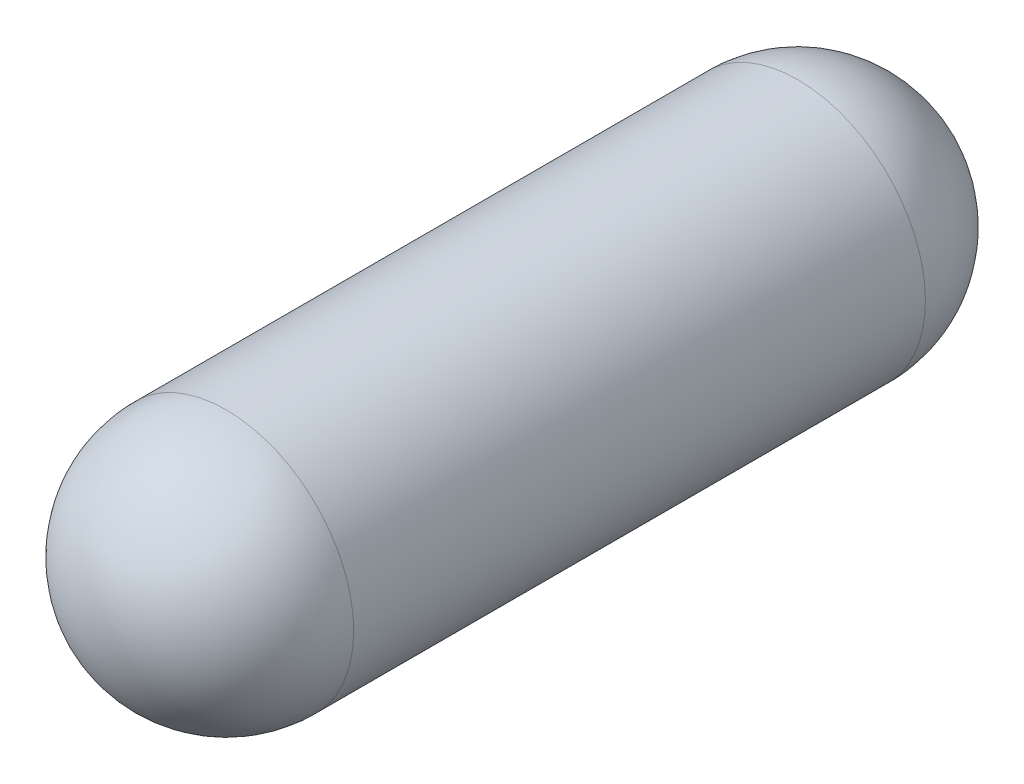
ISO-10303-21;
HEADER;
FILE_DESCRIPTION(('STEP AP214'),'2;1');
FILE_NAME('part.step','',(''),(''),'','','');
FILE_SCHEMA(('AUTOMOTIVE_DESIGN { 1 0 10303 214 1 1 1 1 }'));
ENDSEC;
DATA;
#1=APPLICATION_CONTEXT('core data for automotive mechanical design processes');
#2=APPLICATION_PROTOCOL_DEFINITION('international standard','automotive_design',2000,#1);
#3=PRODUCT_CONTEXT('',#1,'mechanical');
#4=PRODUCT('Part','Part','',(#3));
#5=PRODUCT_RELATED_PRODUCT_CATEGORY('part','',(#4));
#6=PRODUCT_DEFINITION_FORMATION('','',#4);
#7=PRODUCT_DEFINITION_CONTEXT('part definition',#1,'design');
#8=PRODUCT_DEFINITION('design','',#6,#7);
#9=PRODUCT_DEFINITION_SHAPE('','',#8);
#10=(LENGTH_UNIT() NAMED_UNIT(*) SI_UNIT(.MILLI.,.METRE.));
#11=(NAMED_UNIT(*) PLANE_ANGLE_UNIT() SI_UNIT($,.RADIAN.));
#12=(NAMED_UNIT(*) SI_UNIT($,.STERADIAN.) SOLID_ANGLE_UNIT());
#13=UNCERTAINTY_MEASURE_WITH_UNIT(LENGTH_MEASURE(1.E-05),#10,'distance_accuracy_value','');
#14=(GEOMETRIC_REPRESENTATION_CONTEXT(3) GLOBAL_UNCERTAINTY_ASSIGNED_CONTEXT((#13)) GLOBAL_UNIT_ASSIGNED_CONTEXT((#10,
#11,#12)) REPRESENTATION_CONTEXT('',''));
#15=CARTESIAN_POINT('',(0.,0.,0.));
#16=DIRECTION('',(0.,0.,1.));
#17=DIRECTION('',(1.,0.,0.));
#18=AXIS2_PLACEMENT_3D('',#15,#16,#17);
#19=CARTESIAN_POINT('',(-7.0104,1.27,-3.));
#20=DIRECTION('',(1.,0.,0.));
#21=DIRECTION('',(0.,-1.,0.));
#22=AXIS2_PLACEMENT_3D('',#19,#20,#21);
#23=SPHERICAL_SURFACE('',#22,1.45);
#24=CARTESIAN_POINT('',(-7.0104,1.27,-3.));
#25=DIRECTION('',(0.,0.,1.));
#26=DIRECTION('',(1.,0.,0.));
#27=AXIS2_PLACEMENT_3D('',#24,#25,#26);
#28=CIRCLE('',#27,1.45);
#29=CARTESIAN_POINT('',(-5.5604,1.27,-3.));
#30=VERTEX_POINT('',#29);
#31=CARTESIAN_POINT('',(-8.4604,1.27,-3.));
#32=VERTEX_POINT('',#31);
#33=EDGE_CURVE('E42',#30,#32,#28,.T.);
#34=ORIENTED_EDGE('',*,*,#33,.F.);
#35=CARTESIAN_POINT('',(-7.0104,1.27,-3.));
#36=DIRECTION('',(0.,0.,1.));
#37=DIRECTION('',(1.,0.,0.));
#38=AXIS2_PLACEMENT_3D('',#35,#36,#37);
#39=CIRCLE('',#38,1.45);
#40=EDGE_CURVE('E26',#32,#30,#39,.T.);
#41=ORIENTED_EDGE('',*,*,#40,.F.);
#42=EDGE_LOOP('',(#34,#41));
#43=FACE_BOUND('',#42,.T.);
#44=ADVANCED_FACE('F17',(#43),#23,.T.);
#45=CARTESIAN_POINT('',(-7.0104,1.27,3.5));
#46=DIRECTION('',(1.,0.,0.));
#47=DIRECTION('',(0.,1.,0.));
#48=AXIS2_PLACEMENT_3D('',#45,#46,#47);
#49=SPHERICAL_SURFACE('',#48,1.45);
#50=CARTESIAN_POINT('',(-7.0104,1.27,3.5));
#51=DIRECTION('',(0.,0.,1.));
#52=DIRECTION('',(1.,0.,0.));
#53=AXIS2_PLACEMENT_3D('',#50,#51,#52);
#54=CIRCLE('',#53,1.45);
#55=CARTESIAN_POINT('',(-5.5604,1.27,3.5));
#56=VERTEX_POINT('',#55);
#57=CARTESIAN_POINT('',(-8.4604,1.27,3.5));
#58=VERTEX_POINT('',#57);
#59=EDGE_CURVE('E11',#56,#58,#54,.F.);
#60=ORIENTED_EDGE('',*,*,#59,.F.);
#61=CARTESIAN_POINT('',(-7.0104,1.27,3.5));
#62=DIRECTION('',(0.,0.,1.));
#63=DIRECTION('',(1.,0.,0.));
#64=AXIS2_PLACEMENT_3D('',#61,#62,#63);
#65=CIRCLE('',#64,1.45);
#66=EDGE_CURVE('E34',#58,#56,#65,.F.);
#67=ORIENTED_EDGE('',*,*,#66,.F.);
#68=EDGE_LOOP('',(#60,#67));
#69=FACE_BOUND('',#68,.T.);
#70=ADVANCED_FACE('F49',(#69),#49,.T.);
#71=CARTESIAN_POINT('',(-7.0104,1.27,-3.));
#72=DIRECTION('',(0.,0.,1.));
#73=DIRECTION('',(1.,0.,0.));
#74=AXIS2_PLACEMENT_3D('',#71,#72,#73);
#75=CYLINDRICAL_SURFACE('',#74,1.45);
#76=ORIENTED_EDGE('',*,*,#66,.T.);
#77=ORIENTED_EDGE('',*,*,#59,.T.);
#78=EDGE_LOOP('',(#76,#77));
#79=FACE_BOUND('',#78,.T.);
#80=ORIENTED_EDGE('',*,*,#40,.T.);
#81=ORIENTED_EDGE('',*,*,#33,.T.);
#82=EDGE_LOOP('',(#80,#81));
#83=FACE_BOUND('',#82,.T.);
#84=ADVANCED_FACE('F45',(#79,#83),#75,.T.);
#85=CLOSED_SHELL('',(#44,#70,#84));
#86=MANIFOLD_SOLID_BREP('B1',#85);
#87=ADVANCED_BREP_SHAPE_REPRESENTATION('',(#18,#86),#14);
#88=SHAPE_DEFINITION_REPRESENTATION(#9,#87);
ENDSEC;
END-ISO-10303-21;
